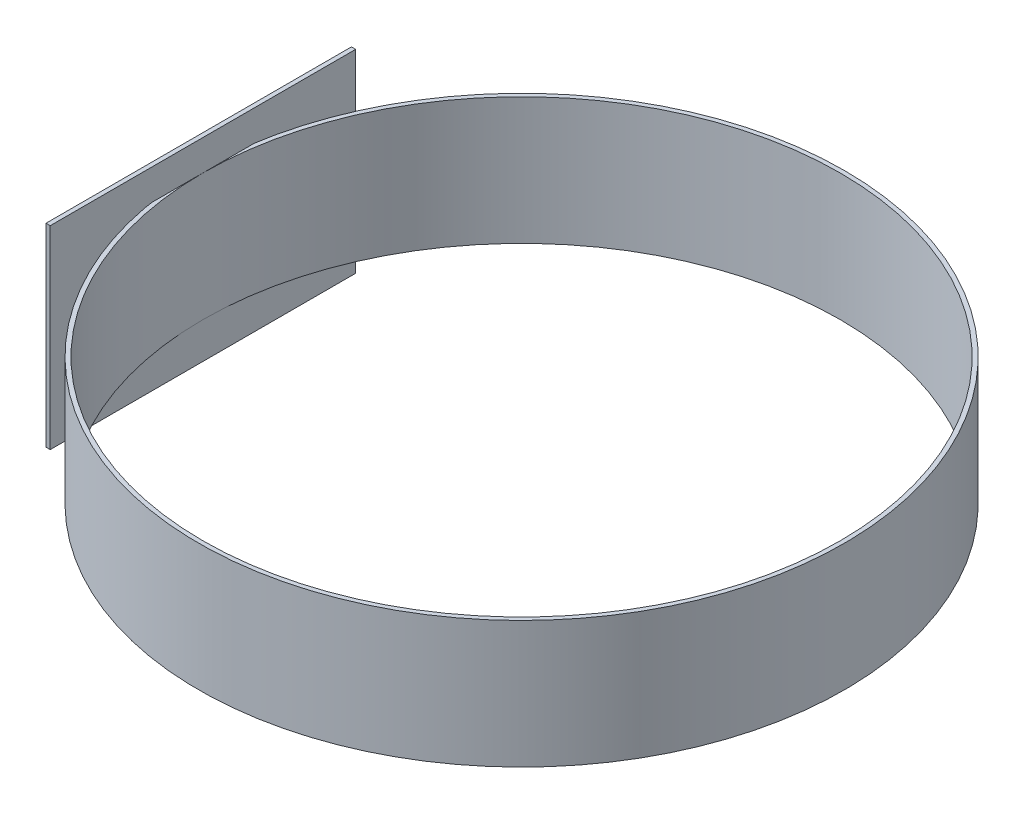
ISO-10303-21;
HEADER;
FILE_DESCRIPTION(('STEP AP214'),'2;1');
FILE_NAME('part.step','',(''),(''),'','','');
FILE_SCHEMA(('AUTOMOTIVE_DESIGN { 1 0 10303 214 1 1 1 1 }'));
ENDSEC;
DATA;
#1=APPLICATION_CONTEXT('core data for automotive mechanical design processes');
#2=APPLICATION_PROTOCOL_DEFINITION('international standard','automotive_design',2000,#1);
#3=PRODUCT_CONTEXT('',#1,'mechanical');
#4=PRODUCT('Part','Part','',(#3));
#5=PRODUCT_RELATED_PRODUCT_CATEGORY('part','',(#4));
#6=PRODUCT_DEFINITION_FORMATION('','',#4);
#7=PRODUCT_DEFINITION_CONTEXT('part definition',#1,'design');
#8=PRODUCT_DEFINITION('design','',#6,#7);
#9=PRODUCT_DEFINITION_SHAPE('','',#8);
#10=(LENGTH_UNIT() NAMED_UNIT(*) SI_UNIT(.MILLI.,.METRE.));
#11=(NAMED_UNIT(*) PLANE_ANGLE_UNIT() SI_UNIT($,.RADIAN.));
#12=(NAMED_UNIT(*) SI_UNIT($,.STERADIAN.) SOLID_ANGLE_UNIT());
#13=UNCERTAINTY_MEASURE_WITH_UNIT(LENGTH_MEASURE(1.E-05),#10,'distance_accuracy_value','');
#14=(GEOMETRIC_REPRESENTATION_CONTEXT(3) GLOBAL_UNCERTAINTY_ASSIGNED_CONTEXT((#13)) GLOBAL_UNIT_ASSIGNED_CONTEXT((#10,
#11,#12)) REPRESENTATION_CONTEXT('',''));
#15=CARTESIAN_POINT('',(0.,0.,0.));
#16=DIRECTION('',(0.,0.,1.));
#17=DIRECTION('',(1.,0.,0.));
#18=AXIS2_PLACEMENT_3D('',#15,#16,#17);
#19=CARTESIAN_POINT('',(-76.25,0.,0.));
#20=DIRECTION('',(-1.,0.,0.));
#21=DIRECTION('',(0.,0.,1.));
#22=AXIS2_PLACEMENT_3D('',#19,#20,#21);
#23=PLANE('',#22);
#24=DIRECTION('',(0.,1.,0.));
#25=VECTOR('',#24,1.);
#26=CARTESIAN_POINT('',(-76.25,37.2471435026434,-36.0693332528056));
#27=LINE('',#26,#25);
#28=CARTESIAN_POINT('',(-76.25,-8.56354252646737,-36.0693332528056));
#29=VERTEX_POINT('',#28);
#30=CARTESIAN_POINT('',(-76.25,37.2471435026434,-36.0693332528056));
#31=VERTEX_POINT('',#30);
#32=EDGE_CURVE('P0_E58',#29,#31,#27,.T.);
#33=ORIENTED_EDGE('',*,*,#32,.F.);
#34=DIRECTION('',(0.,0.,-1.));
#35=VECTOR('',#34,1.);
#36=CARTESIAN_POINT('',(-76.25,-8.56354252646737,-36.0693332528056));
#37=LINE('',#36,#35);
#38=CARTESIAN_POINT('',(-76.25,-8.56354252646737,36.0693332528056));
#39=VERTEX_POINT('',#38);
#40=EDGE_CURVE('P0_E53',#39,#29,#37,.T.);
#41=ORIENTED_EDGE('',*,*,#40,.F.);
#42=DIRECTION('',(0.,1.,0.));
#43=VECTOR('',#42,1.);
#44=CARTESIAN_POINT('',(-76.25,37.2471435026434,36.0693332528056));
#45=LINE('',#44,#43);
#46=CARTESIAN_POINT('',(-76.25,37.2471435026434,36.0693332528056));
#47=VERTEX_POINT('',#46);
#48=EDGE_CURVE('P0_E68',#47,#39,#45,.F.);
#49=ORIENTED_EDGE('',*,*,#48,.F.);
#50=DIRECTION('',(0.,0.,1.));
#51=VECTOR('',#50,1.);
#52=CARTESIAN_POINT('',(-76.25,37.2471435026434,-36.0693332528056));
#53=LINE('',#52,#51);
#54=EDGE_CURVE('P0_E20',#31,#47,#53,.T.);
#55=ORIENTED_EDGE('',*,*,#54,.F.);
#56=EDGE_LOOP('',(#33,#41,#49,#55));
#57=FACE_BOUND('',#56,.T.);
#58=ADVANCED_FACE('P0_F17',(#57),#23,.T.);
#59=CARTESIAN_POINT('',(-75.25,37.2471435026434,-36.0693332528056));
#60=DIRECTION('',(0.,1.,0.));
#61=DIRECTION('',(0.,0.,1.));
#62=AXIS2_PLACEMENT_3D('',#59,#60,#61);
#63=PLANE('',#62);
#64=DIRECTION('',(0.,0.,1.));
#65=VECTOR('',#64,1.);
#66=CARTESIAN_POINT('',(-75.25,37.2471435026434,0.));
#67=LINE('',#66,#65);
#68=CARTESIAN_POINT('',(-75.25,37.2471435026434,36.0693332528056));
#69=VERTEX_POINT('',#68);
#70=CARTESIAN_POINT('',(-75.25,37.2471435026434,-36.0693332528056));
#71=VERTEX_POINT('',#70);
#72=EDGE_CURVE('P0_E74',#69,#71,#67,.F.);
#73=ORIENTED_EDGE('',*,*,#72,.T.);
#74=DIRECTION('',(-1.,0.,0.));
#75=VECTOR('',#74,1.);
#76=CARTESIAN_POINT('',(-75.25,37.2471435026434,-36.0693332528056));
#77=LINE('',#76,#75);
#78=EDGE_CURVE('P0_E63',#31,#71,#77,.F.);
#79=ORIENTED_EDGE('',*,*,#78,.F.);
#80=ORIENTED_EDGE('',*,*,#54,.T.);
#81=DIRECTION('',(1.,0.,0.));
#82=VECTOR('',#81,1.);
#83=CARTESIAN_POINT('',(-75.25,37.2471435026434,36.0693332528056));
#84=LINE('',#83,#82);
#85=EDGE_CURVE('P0_E81',#69,#47,#84,.F.);
#86=ORIENTED_EDGE('',*,*,#85,.F.);
#87=EDGE_LOOP('',(#73,#79,#80,#86));
#88=FACE_BOUND('',#87,.T.);
#89=ADVANCED_FACE('P0_F73',(#88),#63,.T.);
#90=CARTESIAN_POINT('',(-75.25,37.2471435026434,-36.0693332528056));
#91=DIRECTION('',(0.,0.,-1.));
#92=DIRECTION('',(-1.,0.,0.));
#93=AXIS2_PLACEMENT_3D('',#90,#91,#92);
#94=PLANE('',#93);
#95=DIRECTION('',(0.,1.,0.));
#96=VECTOR('',#95,1.);
#97=CARTESIAN_POINT('',(-75.25,0.,-36.0693332528056));
#98=LINE('',#97,#96);
#99=CARTESIAN_POINT('',(-75.25,-8.56354252646737,-36.0693332528056));
#100=VERTEX_POINT('',#99);
#101=EDGE_CURVE('P0_E84',#71,#100,#98,.F.);
#102=ORIENTED_EDGE('',*,*,#101,.T.);
#103=DIRECTION('',(1.,0.,0.));
#104=VECTOR('',#103,1.);
#105=CARTESIAN_POINT('',(-75.25,-8.56354252646737,-36.0693332528056));
#106=LINE('',#105,#104);
#107=EDGE_CURVE('P0_E65',#29,#100,#106,.T.);
#108=ORIENTED_EDGE('',*,*,#107,.F.);
#109=ORIENTED_EDGE('',*,*,#32,.T.);
#110=ORIENTED_EDGE('',*,*,#78,.T.);
#111=EDGE_LOOP('',(#102,#108,#109,#110));
#112=FACE_BOUND('',#111,.T.);
#113=ADVANCED_FACE('P0_F61',(#112),#94,.T.);
#114=CARTESIAN_POINT('',(-75.25,-8.56354252646737,-36.0693332528056));
#115=DIRECTION('',(0.,-1.,0.));
#116=DIRECTION('',(0.,0.,-1.));
#117=AXIS2_PLACEMENT_3D('',#114,#115,#116);
#118=PLANE('',#117);
#119=DIRECTION('',(0.,0.,1.));
#120=VECTOR('',#119,1.);
#121=CARTESIAN_POINT('',(-75.25,-8.56354252646737,0.));
#122=LINE('',#121,#120);
#123=CARTESIAN_POINT('',(-75.25,-8.56354252646737,36.0693332528056));
#124=VERTEX_POINT('',#123);
#125=EDGE_CURVE('P0_E26',#100,#124,#122,.T.);
#126=ORIENTED_EDGE('',*,*,#125,.T.);
#127=DIRECTION('',(1.,0.,0.));
#128=VECTOR('',#127,1.);
#129=CARTESIAN_POINT('',(-75.25,-8.56354252646737,36.0693332528056));
#130=LINE('',#129,#128);
#131=EDGE_CURVE('P0_E34',#39,#124,#130,.T.);
#132=ORIENTED_EDGE('',*,*,#131,.F.);
#133=ORIENTED_EDGE('',*,*,#40,.T.);
#134=ORIENTED_EDGE('',*,*,#107,.T.);
#135=EDGE_LOOP('',(#126,#132,#133,#134));
#136=FACE_BOUND('',#135,.T.);
#137=ADVANCED_FACE('P0_F88',(#136),#118,.T.);
#138=CARTESIAN_POINT('',(-75.25,37.2471435026434,36.0693332528056));
#139=DIRECTION('',(0.,0.,1.));
#140=DIRECTION('',(1.,0.,0.));
#141=AXIS2_PLACEMENT_3D('',#138,#139,#140);
#142=PLANE('',#141);
#143=DIRECTION('',(0.,1.,0.));
#144=VECTOR('',#143,1.);
#145=CARTESIAN_POINT('',(-75.25,0.,36.0693332528056));
#146=LINE('',#145,#144);
#147=EDGE_CURVE('P0_E11',#124,#69,#146,.T.);
#148=ORIENTED_EDGE('',*,*,#147,.T.);
#149=ORIENTED_EDGE('',*,*,#85,.T.);
#150=ORIENTED_EDGE('',*,*,#48,.T.);
#151=ORIENTED_EDGE('',*,*,#131,.T.);
#152=EDGE_LOOP('',(#148,#149,#150,#151));
#153=FACE_BOUND('',#152,.T.);
#154=ADVANCED_FACE('P0_F91',(#153),#142,.T.);
#155=CARTESIAN_POINT('',(-75.25,0.,0.));
#156=DIRECTION('',(-1.,0.,0.));
#157=DIRECTION('',(0.,0.,1.));
#158=AXIS2_PLACEMENT_3D('',#155,#156,#157);
#159=PLANE('',#158);
#160=ORIENTED_EDGE('',*,*,#125,.F.);
#161=ORIENTED_EDGE('',*,*,#101,.F.);
#162=ORIENTED_EDGE('',*,*,#72,.F.);
#163=ORIENTED_EDGE('',*,*,#147,.F.);
#164=EDGE_LOOP('',(#160,#161,#162,#163));
#165=FACE_BOUND('',#164,.T.);
#166=ADVANCED_FACE('P0_F90',(#165),#159,.F.);
#167=CLOSED_SHELL('',(#58,#89,#113,#137,#154,#166));
#168=MANIFOLD_SOLID_BREP('P0_B1',#167);
#169=CARTESIAN_POINT('',(0.,30.,0.));
#170=DIRECTION('',(0.,-1.,0.));
#171=DIRECTION('',(0.,0.,-1.));
#172=AXIS2_PLACEMENT_3D('',#169,#170,#171);
#173=CYLINDRICAL_SURFACE('',#172,75.25);
#174=CARTESIAN_POINT('',(0.,0.,0.));
#175=DIRECTION('',(0.,-1.,0.));
#176=DIRECTION('',(0.,0.,-1.));
#177=AXIS2_PLACEMENT_3D('',#174,#175,#176);
#178=CIRCLE('',#177,75.25);
#179=CARTESIAN_POINT('',(0.,0.,-75.25));
#180=VERTEX_POINT('',#179);
#181=EDGE_CURVE('P1_E27',#180,#180,#178,.T.);
#182=ORIENTED_EDGE('',*,*,#181,.T.);
#183=EDGE_LOOP('',(#182));
#184=FACE_BOUND('',#183,.T.);
#185=CARTESIAN_POINT('',(0.,30.,0.));
#186=DIRECTION('',(0.,-1.,0.));
#187=DIRECTION('',(0.,0.,-1.));
#188=AXIS2_PLACEMENT_3D('',#185,#186,#187);
#189=CIRCLE('',#188,75.25);
#190=CARTESIAN_POINT('',(0.,30.,-75.25));
#191=VERTEX_POINT('',#190);
#192=EDGE_CURVE('P1_E18',#191,#191,#189,.T.);
#193=ORIENTED_EDGE('',*,*,#192,.F.);
#194=EDGE_LOOP('',(#193));
#195=FACE_BOUND('',#194,.T.);
#196=ADVANCED_FACE('P1_F15',(#184,#195),#173,.F.);
#197=CARTESIAN_POINT('',(0.,30.,0.));
#198=DIRECTION('',(0.,1.,0.));
#199=DIRECTION('',(0.,0.,1.));
#200=AXIS2_PLACEMENT_3D('',#197,#198,#199);
#201=PLANE('',#200);
#202=ORIENTED_EDGE('',*,*,#192,.T.);
#203=EDGE_LOOP('',(#202));
#204=FACE_BOUND('',#203,.T.);
#205=CARTESIAN_POINT('',(0.,30.,0.));
#206=DIRECTION('',(0.,-1.,0.));
#207=DIRECTION('',(0.,0.,-1.));
#208=AXIS2_PLACEMENT_3D('',#205,#206,#207);
#209=CIRCLE('',#208,76.25);
#210=CARTESIAN_POINT('',(0.,30.,-76.25));
#211=VERTEX_POINT('',#210);
#212=EDGE_CURVE('P1_E22',#211,#211,#209,.T.);
#213=ORIENTED_EDGE('',*,*,#212,.F.);
#214=EDGE_LOOP('',(#213));
#215=FACE_BOUND('',#214,.T.);
#216=ADVANCED_FACE('P1_F35',(#204,#215),#201,.T.);
#217=CARTESIAN_POINT('',(0.,0.,0.));
#218=DIRECTION('',(0.,1.,0.));
#219=DIRECTION('',(0.,0.,1.));
#220=AXIS2_PLACEMENT_3D('',#217,#218,#219);
#221=PLANE('',#220);
#222=ORIENTED_EDGE('',*,*,#181,.F.);
#223=EDGE_LOOP('',(#222));
#224=FACE_BOUND('',#223,.T.);
#225=CARTESIAN_POINT('',(0.,0.,0.));
#226=DIRECTION('',(0.,-1.,0.));
#227=DIRECTION('',(0.,0.,-1.));
#228=AXIS2_PLACEMENT_3D('',#225,#226,#227);
#229=CIRCLE('',#228,76.25);
#230=CARTESIAN_POINT('',(0.,0.,-76.25));
#231=VERTEX_POINT('',#230);
#232=EDGE_CURVE('P1_E10',#231,#231,#229,.F.);
#233=ORIENTED_EDGE('',*,*,#232,.F.);
#234=EDGE_LOOP('',(#233));
#235=FACE_BOUND('',#234,.T.);
#236=ADVANCED_FACE('P1_F43',(#224,#235),#221,.F.);
#237=CARTESIAN_POINT('',(0.,30.,0.));
#238=DIRECTION('',(0.,-1.,0.));
#239=DIRECTION('',(0.,0.,-1.));
#240=AXIS2_PLACEMENT_3D('',#237,#238,#239);
#241=CYLINDRICAL_SURFACE('',#240,76.25);
#242=ORIENTED_EDGE('',*,*,#232,.T.);
#243=EDGE_LOOP('',(#242));
#244=FACE_BOUND('',#243,.T.);
#245=ORIENTED_EDGE('',*,*,#212,.T.);
#246=EDGE_LOOP('',(#245));
#247=FACE_BOUND('',#246,.T.);
#248=ADVANCED_FACE('P1_F44',(#244,#247),#241,.T.);
#249=CLOSED_SHELL('',(#196,#216,#236,#248));
#250=MANIFOLD_SOLID_BREP('P1_B1',#249);
#251=ADVANCED_BREP_SHAPE_REPRESENTATION('',(#18,#168,#250),#14);
#252=SHAPE_DEFINITION_REPRESENTATION(#9,#251);
ENDSEC;
END-ISO-10303-21;
